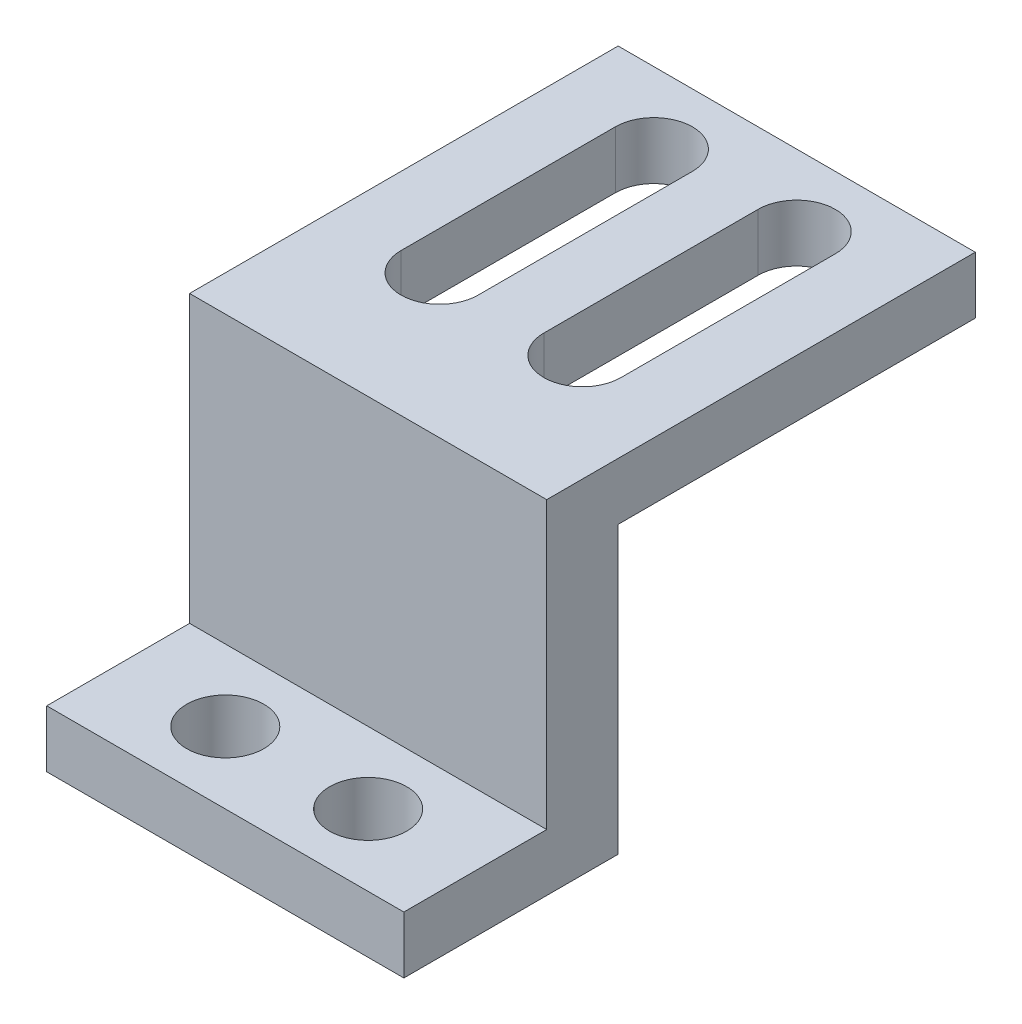
ISO-10303-21;
HEADER;
FILE_DESCRIPTION(('STEP AP214'),'2;1');
FILE_NAME('part.step','',(''),(''),'','','');
FILE_SCHEMA(('AUTOMOTIVE_DESIGN { 1 0 10303 214 1 1 1 1 }'));
ENDSEC;
DATA;
#1=APPLICATION_CONTEXT('core data for automotive mechanical design processes');
#2=APPLICATION_PROTOCOL_DEFINITION('international standard','automotive_design',2000,#1);
#3=PRODUCT_CONTEXT('',#1,'mechanical');
#4=PRODUCT('Part','Part','',(#3));
#5=PRODUCT_RELATED_PRODUCT_CATEGORY('part','',(#4));
#6=PRODUCT_DEFINITION_FORMATION('','',#4);
#7=PRODUCT_DEFINITION_CONTEXT('part definition',#1,'design');
#8=PRODUCT_DEFINITION('design','',#6,#7);
#9=PRODUCT_DEFINITION_SHAPE('','',#8);
#10=(LENGTH_UNIT() NAMED_UNIT(*) SI_UNIT(.MILLI.,.METRE.));
#11=(NAMED_UNIT(*) PLANE_ANGLE_UNIT() SI_UNIT($,.RADIAN.));
#12=(NAMED_UNIT(*) SI_UNIT($,.STERADIAN.) SOLID_ANGLE_UNIT());
#13=UNCERTAINTY_MEASURE_WITH_UNIT(LENGTH_MEASURE(1.E-05),#10,'distance_accuracy_value','');
#14=(GEOMETRIC_REPRESENTATION_CONTEXT(3) GLOBAL_UNCERTAINTY_ASSIGNED_CONTEXT((#13)) GLOBAL_UNIT_ASSIGNED_CONTEXT((#10,
#11,#12)) REPRESENTATION_CONTEXT('',''));
#15=CARTESIAN_POINT('',(0.,0.,0.));
#16=DIRECTION('',(0.,0.,1.));
#17=DIRECTION('',(1.,0.,0.));
#18=AXIS2_PLACEMENT_3D('',#15,#16,#17);
#19=CARTESIAN_POINT('',(15.875,5.08,0.));
#20=DIRECTION('',(0.,0.,-1.));
#21=DIRECTION('',(0.,1.,0.));
#22=AXIS2_PLACEMENT_3D('',#19,#20,#21);
#23=PLANE('',#22);
#24=DIRECTION('',(0.,-1.,0.));
#25=VECTOR('',#24,1.);
#26=CARTESIAN_POINT('',(-15.875,5.08,0.));
#27=LINE('',#26,#25);
#28=CARTESIAN_POINT('',(-15.875,5.08,0.));
#29=VERTEX_POINT('',#28);
#30=CARTESIAN_POINT('',(-15.875,0.,0.));
#31=VERTEX_POINT('',#30);
#32=EDGE_CURVE('E226',#29,#31,#27,.T.);
#33=ORIENTED_EDGE('',*,*,#32,.T.);
#34=DIRECTION('',(-1.,0.,0.));
#35=VECTOR('',#34,1.);
#36=CARTESIAN_POINT('',(15.875,0.,0.));
#37=LINE('',#36,#35);
#38=CARTESIAN_POINT('',(15.875,0.,0.));
#39=VERTEX_POINT('',#38);
#40=EDGE_CURVE('E11',#39,#31,#37,.T.);
#41=ORIENTED_EDGE('',*,*,#40,.F.);
#42=DIRECTION('',(0.,-1.,0.));
#43=VECTOR('',#42,1.);
#44=CARTESIAN_POINT('',(15.875,5.08,0.));
#45=LINE('',#44,#43);
#46=CARTESIAN_POINT('',(15.875,5.08,0.));
#47=VERTEX_POINT('',#46);
#48=EDGE_CURVE('E227',#47,#39,#45,.T.);
#49=ORIENTED_EDGE('',*,*,#48,.F.);
#50=DIRECTION('',(-1.,0.,0.));
#51=VECTOR('',#50,1.);
#52=CARTESIAN_POINT('',(15.875,5.08,0.));
#53=LINE('',#52,#51);
#54=EDGE_CURVE('E245',#47,#29,#53,.T.);
#55=ORIENTED_EDGE('',*,*,#54,.T.);
#56=EDGE_LOOP('',(#33,#41,#49,#55));
#57=FACE_BOUND('',#56,.T.);
#58=ADVANCED_FACE('F35',(#57),#23,.F.);
#59=CARTESIAN_POINT('',(15.875,0.,0.));
#60=DIRECTION('',(0.,1.,0.));
#61=DIRECTION('',(0.,0.,1.));
#62=AXIS2_PLACEMENT_3D('',#59,#60,#61);
#63=PLANE('',#62);
#64=CARTESIAN_POINT('',(6.35,0.,-6.35));
#65=DIRECTION('',(0.,1.,0.));
#66=DIRECTION('',(0.,0.,1.));
#67=AXIS2_PLACEMENT_3D('',#64,#65,#66);
#68=CIRCLE('',#67,3.429);
#69=CARTESIAN_POINT('',(6.35,0.,-2.921));
#70=VERTEX_POINT('',#69);
#71=EDGE_CURVE('E181',#70,#70,#68,.T.);
#72=ORIENTED_EDGE('',*,*,#71,.T.);
#73=EDGE_LOOP('',(#72));
#74=FACE_BOUND('',#73,.T.);
#75=CARTESIAN_POINT('',(-6.35,0.,-6.35));
#76=DIRECTION('',(0.,1.,0.));
#77=DIRECTION('',(0.,0.,1.));
#78=AXIS2_PLACEMENT_3D('',#75,#76,#77);
#79=CIRCLE('',#78,3.429);
#80=CARTESIAN_POINT('',(-6.35,0.,-2.921));
#81=VERTEX_POINT('',#80);
#82=EDGE_CURVE('E184',#81,#81,#79,.T.);
#83=ORIENTED_EDGE('',*,*,#82,.T.);
#84=EDGE_LOOP('',(#83));
#85=FACE_BOUND('',#84,.T.);
#86=DIRECTION('',(0.,0.,-1.));
#87=VECTOR('',#86,1.);
#88=CARTESIAN_POINT('',(-15.875,0.,0.));
#89=LINE('',#88,#87);
#90=CARTESIAN_POINT('',(-15.875,0.,-19.05));
#91=VERTEX_POINT('',#90);
#92=EDGE_CURVE('E248',#31,#91,#89,.T.);
#93=ORIENTED_EDGE('',*,*,#92,.T.);
#94=DIRECTION('',(-1.,0.,0.));
#95=VECTOR('',#94,1.);
#96=CARTESIAN_POINT('',(15.875,0.,-19.05));
#97=LINE('',#96,#95);
#98=CARTESIAN_POINT('',(15.875,0.,-19.05));
#99=VERTEX_POINT('',#98);
#100=EDGE_CURVE('E43',#99,#91,#97,.T.);
#101=ORIENTED_EDGE('',*,*,#100,.F.);
#102=DIRECTION('',(0.,0.,-1.));
#103=VECTOR('',#102,1.);
#104=CARTESIAN_POINT('',(15.875,0.,0.));
#105=LINE('',#104,#103);
#106=EDGE_CURVE('E230',#39,#99,#105,.T.);
#107=ORIENTED_EDGE('',*,*,#106,.F.);
#108=ORIENTED_EDGE('',*,*,#40,.T.);
#109=EDGE_LOOP('',(#93,#101,#107,#108));
#110=FACE_BOUND('',#109,.T.);
#111=ADVANCED_FACE('F308',(#74,#85,#110),#63,.F.);
#112=CARTESIAN_POINT('',(15.875,0.,-19.05));
#113=DIRECTION('',(0.,0.,1.));
#114=DIRECTION('',(1.,0.,0.));
#115=AXIS2_PLACEMENT_3D('',#112,#113,#114);
#116=PLANE('',#115);
#117=DIRECTION('',(0.,1.,0.));
#118=VECTOR('',#117,1.);
#119=CARTESIAN_POINT('',(-15.875,0.,-19.05));
#120=LINE('',#119,#118);
#121=CARTESIAN_POINT('',(-15.875,25.4,-19.05));
#122=VERTEX_POINT('',#121);
#123=EDGE_CURVE('E250',#91,#122,#120,.T.);
#124=ORIENTED_EDGE('',*,*,#123,.T.);
#125=DIRECTION('',(-1.,0.,0.));
#126=VECTOR('',#125,1.);
#127=CARTESIAN_POINT('',(15.875,25.4,-19.05));
#128=LINE('',#127,#126);
#129=CARTESIAN_POINT('',(15.875,25.4,-19.05));
#130=VERTEX_POINT('',#129);
#131=EDGE_CURVE('E277',#130,#122,#128,.T.);
#132=ORIENTED_EDGE('',*,*,#131,.F.);
#133=DIRECTION('',(0.,1.,0.));
#134=VECTOR('',#133,1.);
#135=CARTESIAN_POINT('',(15.875,0.,-19.05));
#136=LINE('',#135,#134);
#137=EDGE_CURVE('E233',#99,#130,#136,.T.);
#138=ORIENTED_EDGE('',*,*,#137,.F.);
#139=ORIENTED_EDGE('',*,*,#100,.T.);
#140=EDGE_LOOP('',(#124,#132,#138,#139));
#141=FACE_BOUND('',#140,.T.);
#142=ADVANCED_FACE('F313',(#141),#116,.F.);
#143=CARTESIAN_POINT('',(15.875,25.4,-50.8));
#144=DIRECTION('',(0.,1.,0.));
#145=DIRECTION('',(0.,0.,1.));
#146=AXIS2_PLACEMENT_3D('',#143,#144,#145);
#147=PLANE('',#146);
#148=DIRECTION('',(0.,0.,-1.));
#149=VECTOR('',#148,1.);
#150=CARTESIAN_POINT('',(-2.92100000000001,25.4,-50.8));
#151=LINE('',#150,#149);
#152=CARTESIAN_POINT('',(-2.921,25.4,-25.4));
#153=VERTEX_POINT('',#152);
#154=CARTESIAN_POINT('',(-2.921,25.4,-44.45));
#155=VERTEX_POINT('',#154);
#156=EDGE_CURVE('E220',#153,#155,#151,.T.);
#157=ORIENTED_EDGE('',*,*,#156,.T.);
#158=CARTESIAN_POINT('',(-6.35,25.4,-44.45));
#159=DIRECTION('',(0.,1.,0.));
#160=DIRECTION('',(0.,0.,1.));
#161=AXIS2_PLACEMENT_3D('',#158,#159,#160);
#162=CIRCLE('',#161,3.429);
#163=CARTESIAN_POINT('',(-9.779,25.4,-44.45));
#164=VERTEX_POINT('',#163);
#165=EDGE_CURVE('E223',#155,#164,#162,.T.);
#166=ORIENTED_EDGE('',*,*,#165,.T.);
#167=DIRECTION('',(0.,0.,1.));
#168=VECTOR('',#167,1.);
#169=CARTESIAN_POINT('',(-9.779,25.4,-50.8));
#170=LINE('',#169,#168);
#171=CARTESIAN_POINT('',(-9.779,25.4,-25.4));
#172=VERTEX_POINT('',#171);
#173=EDGE_CURVE('E214',#164,#172,#170,.T.);
#174=ORIENTED_EDGE('',*,*,#173,.T.);
#175=CARTESIAN_POINT('',(-6.35,25.4,-25.4));
#176=DIRECTION('',(0.,1.,0.));
#177=DIRECTION('',(0.,0.,1.));
#178=AXIS2_PLACEMENT_3D('',#175,#176,#177);
#179=CIRCLE('',#178,3.429);
#180=EDGE_CURVE('E217',#172,#153,#179,.T.);
#181=ORIENTED_EDGE('',*,*,#180,.T.);
#182=EDGE_LOOP('',(#157,#166,#174,#181));
#183=FACE_BOUND('',#182,.T.);
#184=DIRECTION('',(0.,0.,-1.));
#185=VECTOR('',#184,1.);
#186=CARTESIAN_POINT('',(9.77900000000001,25.4,-50.8));
#187=LINE('',#186,#185);
#188=CARTESIAN_POINT('',(9.77900000000001,25.4,-25.4));
#189=VERTEX_POINT('',#188);
#190=CARTESIAN_POINT('',(9.77900000000001,25.4,-44.45));
#191=VERTEX_POINT('',#190);
#192=EDGE_CURVE('E208',#189,#191,#187,.T.);
#193=ORIENTED_EDGE('',*,*,#192,.T.);
#194=CARTESIAN_POINT('',(6.35,25.4,-44.45));
#195=DIRECTION('',(0.,1.,0.));
#196=DIRECTION('',(0.,0.,1.));
#197=AXIS2_PLACEMENT_3D('',#194,#195,#196);
#198=CIRCLE('',#197,3.42900000000001);
#199=CARTESIAN_POINT('',(2.92099999999999,25.4,-44.45));
#200=VERTEX_POINT('',#199);
#201=EDGE_CURVE('E211',#191,#200,#198,.T.);
#202=ORIENTED_EDGE('',*,*,#201,.T.);
#203=DIRECTION('',(0.,0.,1.));
#204=VECTOR('',#203,1.);
#205=CARTESIAN_POINT('',(2.92099999999999,25.4,-50.8));
#206=LINE('',#205,#204);
#207=CARTESIAN_POINT('',(2.921,25.4,-25.4));
#208=VERTEX_POINT('',#207);
#209=EDGE_CURVE('E205',#200,#208,#206,.T.);
#210=ORIENTED_EDGE('',*,*,#209,.T.);
#211=CARTESIAN_POINT('',(6.35,25.4,-25.4));
#212=DIRECTION('',(0.,1.,0.));
#213=DIRECTION('',(0.,0.,1.));
#214=AXIS2_PLACEMENT_3D('',#211,#212,#213);
#215=CIRCLE('',#214,3.429);
#216=EDGE_CURVE('E154',#208,#189,#215,.T.);
#217=ORIENTED_EDGE('',*,*,#216,.T.);
#218=EDGE_LOOP('',(#193,#202,#210,#217));
#219=FACE_BOUND('',#218,.T.);
#220=DIRECTION('',(0.,0.,-1.));
#221=VECTOR('',#220,1.);
#222=CARTESIAN_POINT('',(-15.875,25.4,-50.8));
#223=LINE('',#222,#221);
#224=CARTESIAN_POINT('',(-15.875,25.4,-50.8));
#225=VERTEX_POINT('',#224);
#226=EDGE_CURVE('E253',#122,#225,#223,.T.);
#227=ORIENTED_EDGE('',*,*,#226,.T.);
#228=DIRECTION('',(-1.,0.,0.));
#229=VECTOR('',#228,1.);
#230=CARTESIAN_POINT('',(15.875,25.4,-50.8));
#231=LINE('',#230,#229);
#232=CARTESIAN_POINT('',(15.875,25.4,-50.8));
#233=VERTEX_POINT('',#232);
#234=EDGE_CURVE('E274',#233,#225,#231,.T.);
#235=ORIENTED_EDGE('',*,*,#234,.F.);
#236=DIRECTION('',(0.,0.,-1.));
#237=VECTOR('',#236,1.);
#238=CARTESIAN_POINT('',(15.875,25.4,-19.05));
#239=LINE('',#238,#237);
#240=EDGE_CURVE('E235',#130,#233,#239,.T.);
#241=ORIENTED_EDGE('',*,*,#240,.F.);
#242=ORIENTED_EDGE('',*,*,#131,.T.);
#243=EDGE_LOOP('',(#227,#235,#241,#242));
#244=FACE_BOUND('',#243,.T.);
#245=ADVANCED_FACE('F345',(#183,#219,#244),#147,.F.);
#246=CARTESIAN_POINT('',(15.875,30.48,-50.8));
#247=DIRECTION('',(0.,0.,1.));
#248=DIRECTION('',(1.,0.,0.));
#249=AXIS2_PLACEMENT_3D('',#246,#247,#248);
#250=PLANE('',#249);
#251=DIRECTION('',(0.,1.,0.));
#252=VECTOR('',#251,1.);
#253=CARTESIAN_POINT('',(-15.875,30.48,-50.8));
#254=LINE('',#253,#252);
#255=CARTESIAN_POINT('',(-15.875,30.48,-50.8));
#256=VERTEX_POINT('',#255);
#257=EDGE_CURVE('E255',#225,#256,#254,.T.);
#258=ORIENTED_EDGE('',*,*,#257,.T.);
#259=DIRECTION('',(-1.,0.,0.));
#260=VECTOR('',#259,1.);
#261=CARTESIAN_POINT('',(15.875,30.48,-50.8));
#262=LINE('',#261,#260);
#263=CARTESIAN_POINT('',(15.875,30.48,-50.8));
#264=VERTEX_POINT('',#263);
#265=EDGE_CURVE('E271',#264,#256,#262,.T.);
#266=ORIENTED_EDGE('',*,*,#265,.F.);
#267=DIRECTION('',(0.,1.,0.));
#268=VECTOR('',#267,1.);
#269=CARTESIAN_POINT('',(15.875,30.48,-50.8));
#270=LINE('',#269,#268);
#271=EDGE_CURVE('E237',#233,#264,#270,.T.);
#272=ORIENTED_EDGE('',*,*,#271,.F.);
#273=ORIENTED_EDGE('',*,*,#234,.T.);
#274=EDGE_LOOP('',(#258,#266,#272,#273));
#275=FACE_BOUND('',#274,.T.);
#276=ADVANCED_FACE('F338',(#275),#250,.F.);
#277=CARTESIAN_POINT('',(15.875,30.48,-31.75));
#278=DIRECTION('',(0.,-1.,0.));
#279=DIRECTION('',(0.,0.,-1.));
#280=AXIS2_PLACEMENT_3D('',#277,#278,#279);
#281=PLANE('',#280);
#282=DIRECTION('',(0.,0.,1.));
#283=VECTOR('',#282,1.);
#284=CARTESIAN_POINT('',(-9.779,30.48,-44.45));
#285=LINE('',#284,#283);
#286=CARTESIAN_POINT('',(-9.77899999999999,30.48,-44.45));
#287=VERTEX_POINT('',#286);
#288=CARTESIAN_POINT('',(-9.779,30.48,-25.4));
#289=VERTEX_POINT('',#288);
#290=EDGE_CURVE('E187',#287,#289,#285,.T.);
#291=ORIENTED_EDGE('',*,*,#290,.F.);
#292=CARTESIAN_POINT('',(-6.35,30.48,-44.45));
#293=DIRECTION('',(0.,1.,0.));
#294=DIRECTION('',(0.,0.,1.));
#295=AXIS2_PLACEMENT_3D('',#292,#293,#294);
#296=CIRCLE('',#295,3.429);
#297=CARTESIAN_POINT('',(-2.921,30.48,-44.45));
#298=VERTEX_POINT('',#297);
#299=EDGE_CURVE('E178',#298,#287,#296,.T.);
#300=ORIENTED_EDGE('',*,*,#299,.F.);
#301=DIRECTION('',(0.,0.,-1.));
#302=VECTOR('',#301,1.);
#303=CARTESIAN_POINT('',(-2.921,30.48,-44.45));
#304=LINE('',#303,#302);
#305=CARTESIAN_POINT('',(-2.921,30.48,-25.4));
#306=VERTEX_POINT('',#305);
#307=EDGE_CURVE('E192',#306,#298,#304,.T.);
#308=ORIENTED_EDGE('',*,*,#307,.F.);
#309=CARTESIAN_POINT('',(-6.35,30.48,-25.4));
#310=DIRECTION('',(0.,1.,0.));
#311=DIRECTION('',(0.,0.,1.));
#312=AXIS2_PLACEMENT_3D('',#309,#310,#311);
#313=CIRCLE('',#312,3.429);
#314=EDGE_CURVE('E189',#289,#306,#313,.T.);
#315=ORIENTED_EDGE('',*,*,#314,.F.);
#316=EDGE_LOOP('',(#291,#300,#308,#315));
#317=FACE_BOUND('',#316,.T.);
#318=DIRECTION('',(0.,0.,1.));
#319=VECTOR('',#318,1.);
#320=CARTESIAN_POINT('',(2.92099999999999,30.48,-44.45));
#321=LINE('',#320,#319);
#322=CARTESIAN_POINT('',(2.92099999999999,30.48,-44.45));
#323=VERTEX_POINT('',#322);
#324=CARTESIAN_POINT('',(2.921,30.48,-25.4));
#325=VERTEX_POINT('',#324);
#326=EDGE_CURVE('E161',#323,#325,#321,.T.);
#327=ORIENTED_EDGE('',*,*,#326,.F.);
#328=CARTESIAN_POINT('',(6.35,30.48,-44.45));
#329=DIRECTION('',(0.,1.,0.));
#330=DIRECTION('',(0.,0.,1.));
#331=AXIS2_PLACEMENT_3D('',#328,#329,#330);
#332=CIRCLE('',#331,3.42900000000001);
#333=CARTESIAN_POINT('',(9.77900000000001,30.48,-44.45));
#334=VERTEX_POINT('',#333);
#335=EDGE_CURVE('E166',#334,#323,#332,.T.);
#336=ORIENTED_EDGE('',*,*,#335,.F.);
#337=DIRECTION('',(0.,0.,-1.));
#338=VECTOR('',#337,1.);
#339=CARTESIAN_POINT('',(9.77900000000001,30.48,-44.45));
#340=LINE('',#339,#338);
#341=CARTESIAN_POINT('',(9.77900000000001,30.48,-25.4));
#342=VERTEX_POINT('',#341);
#343=EDGE_CURVE('E171',#342,#334,#340,.T.);
#344=ORIENTED_EDGE('',*,*,#343,.F.);
#345=CARTESIAN_POINT('',(6.35,30.48,-25.4));
#346=DIRECTION('',(0.,1.,0.));
#347=DIRECTION('',(0.,0.,1.));
#348=AXIS2_PLACEMENT_3D('',#345,#346,#347);
#349=CIRCLE('',#348,3.429);
#350=EDGE_CURVE('E151',#325,#342,#349,.T.);
#351=ORIENTED_EDGE('',*,*,#350,.F.);
#352=EDGE_LOOP('',(#327,#336,#344,#351));
#353=FACE_BOUND('',#352,.T.);
#354=DIRECTION('',(0.,0.,1.));
#355=VECTOR('',#354,1.);
#356=CARTESIAN_POINT('',(-15.875,30.48,-31.75));
#357=LINE('',#356,#355);
#358=CARTESIAN_POINT('',(-15.875,30.48,-12.7));
#359=VERTEX_POINT('',#358);
#360=EDGE_CURVE('E258',#256,#359,#357,.T.);
#361=ORIENTED_EDGE('',*,*,#360,.T.);
#362=DIRECTION('',(-1.,0.,0.));
#363=VECTOR('',#362,1.);
#364=CARTESIAN_POINT('',(15.875,30.48,-12.7));
#365=LINE('',#364,#363);
#366=CARTESIAN_POINT('',(15.875,30.48,-12.7));
#367=VERTEX_POINT('',#366);
#368=EDGE_CURVE('E268',#367,#359,#365,.T.);
#369=ORIENTED_EDGE('',*,*,#368,.F.);
#370=DIRECTION('',(0.,0.,1.));
#371=VECTOR('',#370,1.);
#372=CARTESIAN_POINT('',(15.875,30.48,-31.75));
#373=LINE('',#372,#371);
#374=EDGE_CURVE('E239',#264,#367,#373,.T.);
#375=ORIENTED_EDGE('',*,*,#374,.F.);
#376=ORIENTED_EDGE('',*,*,#265,.T.);
#377=EDGE_LOOP('',(#361,#369,#375,#376));
#378=FACE_BOUND('',#377,.T.);
#379=ADVANCED_FACE('F168',(#317,#353,#378),#281,.F.);
#380=CARTESIAN_POINT('',(15.875,30.48,-12.7));
#381=DIRECTION('',(0.,0.,-1.));
#382=DIRECTION('',(0.,1.,0.));
#383=AXIS2_PLACEMENT_3D('',#380,#381,#382);
#384=PLANE('',#383);
#385=DIRECTION('',(0.,-1.,0.));
#386=VECTOR('',#385,1.);
#387=CARTESIAN_POINT('',(-15.875,30.48,-12.7));
#388=LINE('',#387,#386);
#389=CARTESIAN_POINT('',(-15.875,5.08,-12.7));
#390=VERTEX_POINT('',#389);
#391=EDGE_CURVE('E260',#359,#390,#388,.T.);
#392=ORIENTED_EDGE('',*,*,#391,.T.);
#393=DIRECTION('',(-1.,0.,0.));
#394=VECTOR('',#393,1.);
#395=CARTESIAN_POINT('',(15.875,5.08,-12.7));
#396=LINE('',#395,#394);
#397=CARTESIAN_POINT('',(15.875,5.08,-12.7));
#398=VERTEX_POINT('',#397);
#399=EDGE_CURVE('E265',#398,#390,#396,.T.);
#400=ORIENTED_EDGE('',*,*,#399,.F.);
#401=DIRECTION('',(0.,-1.,0.));
#402=VECTOR('',#401,1.);
#403=CARTESIAN_POINT('',(15.875,30.48,-12.7));
#404=LINE('',#403,#402);
#405=EDGE_CURVE('E241',#367,#398,#404,.T.);
#406=ORIENTED_EDGE('',*,*,#405,.F.);
#407=ORIENTED_EDGE('',*,*,#368,.T.);
#408=EDGE_LOOP('',(#392,#400,#406,#407));
#409=FACE_BOUND('',#408,.T.);
#410=ADVANCED_FACE('F333',(#409),#384,.F.);
#411=CARTESIAN_POINT('',(15.875,5.08,-12.7));
#412=DIRECTION('',(0.,-1.,0.));
#413=DIRECTION('',(0.,0.,-1.));
#414=AXIS2_PLACEMENT_3D('',#411,#412,#413);
#415=PLANE('',#414);
#416=CARTESIAN_POINT('',(6.35,5.08,-6.35));
#417=DIRECTION('',(0.,-1.,0.));
#418=DIRECTION('',(0.,0.,-1.));
#419=AXIS2_PLACEMENT_3D('',#416,#417,#418);
#420=CIRCLE('',#419,3.429);
#421=CARTESIAN_POINT('',(6.35,5.08,-2.921));
#422=VERTEX_POINT('',#421);
#423=EDGE_CURVE('E38',#422,#422,#420,.T.);
#424=ORIENTED_EDGE('',*,*,#423,.T.);
#425=EDGE_LOOP('',(#424));
#426=FACE_BOUND('',#425,.T.);
#427=CARTESIAN_POINT('',(-6.35,5.08,-6.35));
#428=DIRECTION('',(0.,-1.,0.));
#429=DIRECTION('',(0.,0.,-1.));
#430=AXIS2_PLACEMENT_3D('',#427,#428,#429);
#431=CIRCLE('',#430,3.429);
#432=CARTESIAN_POINT('',(-6.35,5.08,-2.921));
#433=VERTEX_POINT('',#432);
#434=EDGE_CURVE('E204',#433,#433,#431,.T.);
#435=ORIENTED_EDGE('',*,*,#434,.T.);
#436=EDGE_LOOP('',(#435));
#437=FACE_BOUND('',#436,.T.);
#438=DIRECTION('',(0.,0.,1.));
#439=VECTOR('',#438,1.);
#440=CARTESIAN_POINT('',(-15.875,5.08,-12.7));
#441=LINE('',#440,#439);
#442=EDGE_CURVE('E231',#390,#29,#441,.T.);
#443=ORIENTED_EDGE('',*,*,#442,.T.);
#444=ORIENTED_EDGE('',*,*,#54,.F.);
#445=DIRECTION('',(0.,0.,1.));
#446=VECTOR('',#445,1.);
#447=CARTESIAN_POINT('',(15.875,5.08,-12.7));
#448=LINE('',#447,#446);
#449=EDGE_CURVE('E243',#398,#47,#448,.T.);
#450=ORIENTED_EDGE('',*,*,#449,.F.);
#451=ORIENTED_EDGE('',*,*,#399,.T.);
#452=EDGE_LOOP('',(#443,#444,#450,#451));
#453=FACE_BOUND('',#452,.T.);
#454=ADVANCED_FACE('F287',(#426,#437,#453),#415,.F.);
#455=CARTESIAN_POINT('',(15.875,0.,0.));
#456=DIRECTION('',(1.,0.,0.));
#457=DIRECTION('',(0.,0.,-1.));
#458=AXIS2_PLACEMENT_3D('',#455,#456,#457);
#459=PLANE('',#458);
#460=ORIENTED_EDGE('',*,*,#48,.T.);
#461=ORIENTED_EDGE('',*,*,#106,.T.);
#462=ORIENTED_EDGE('',*,*,#137,.T.);
#463=ORIENTED_EDGE('',*,*,#240,.T.);
#464=ORIENTED_EDGE('',*,*,#271,.T.);
#465=ORIENTED_EDGE('',*,*,#374,.T.);
#466=ORIENTED_EDGE('',*,*,#405,.T.);
#467=ORIENTED_EDGE('',*,*,#449,.T.);
#468=EDGE_LOOP('',(#460,#461,#462,#463,#464,#465,#466,#467));
#469=FACE_BOUND('',#468,.T.);
#470=ADVANCED_FACE('F327',(#469),#459,.T.);
#471=CARTESIAN_POINT('',(-15.875,0.,0.));
#472=DIRECTION('',(1.,0.,0.));
#473=DIRECTION('',(0.,0.,-1.));
#474=AXIS2_PLACEMENT_3D('',#471,#472,#473);
#475=PLANE('',#474);
#476=ORIENTED_EDGE('',*,*,#32,.F.);
#477=ORIENTED_EDGE('',*,*,#442,.F.);
#478=ORIENTED_EDGE('',*,*,#391,.F.);
#479=ORIENTED_EDGE('',*,*,#360,.F.);
#480=ORIENTED_EDGE('',*,*,#257,.F.);
#481=ORIENTED_EDGE('',*,*,#226,.F.);
#482=ORIENTED_EDGE('',*,*,#123,.F.);
#483=ORIENTED_EDGE('',*,*,#92,.F.);
#484=EDGE_LOOP('',(#476,#477,#478,#479,#480,#481,#482,#483));
#485=FACE_BOUND('',#484,.T.);
#486=ADVANCED_FACE('F302',(#485),#475,.F.);
#487=CARTESIAN_POINT('',(-6.35,0.,-6.35));
#488=DIRECTION('',(0.,1.,0.));
#489=DIRECTION('',(0.,0.,1.));
#490=AXIS2_PLACEMENT_3D('',#487,#488,#489);
#491=CYLINDRICAL_SURFACE('',#490,3.429);
#492=CARTESIAN_POINT('',(-6.35,0.,-2.921));
#493=CARTESIAN_POINT('',(-6.35,0.0529166666666611,-2.921));
#494=CARTESIAN_POINT('',(-6.35,0.105833333333328,-2.921));
#495=CARTESIAN_POINT('',(-6.35,0.211666666666661,-2.921));
#496=CARTESIAN_POINT('',(-6.35,0.264583333333328,-2.921));
#497=CARTESIAN_POINT('',(-6.35,0.370416666666661,-2.921));
#498=CARTESIAN_POINT('',(-6.35,0.423333333333328,-2.921));
#499=CARTESIAN_POINT('',(-6.35,0.529166666666662,-2.921));
#500=CARTESIAN_POINT('',(-6.35,0.582083333333328,-2.921));
#501=CARTESIAN_POINT('',(-6.35,0.687916666666662,-2.921));
#502=CARTESIAN_POINT('',(-6.35,0.740833333333329,-2.921));
#503=CARTESIAN_POINT('',(-6.35,0.846666666666662,-2.921));
#504=CARTESIAN_POINT('',(-6.35,0.899583333333329,-2.921));
#505=CARTESIAN_POINT('',(-6.35,1.00541666666666,-2.921));
#506=CARTESIAN_POINT('',(-6.35,1.05833333333333,-2.921));
#507=CARTESIAN_POINT('',(-6.35,1.16416666666666,-2.921));
#508=CARTESIAN_POINT('',(-6.35,1.21708333333333,-2.921));
#509=CARTESIAN_POINT('',(-6.35,1.32291666666666,-2.921));
#510=CARTESIAN_POINT('',(-6.35,1.37583333333333,-2.921));
#511=CARTESIAN_POINT('',(-6.35,1.48166666666666,-2.921));
#512=CARTESIAN_POINT('',(-6.35,1.53458333333333,-2.921));
#513=CARTESIAN_POINT('',(-6.35,1.64041666666666,-2.921));
#514=CARTESIAN_POINT('',(-6.35,1.69333333333333,-2.921));
#515=CARTESIAN_POINT('',(-6.35,1.79916666666666,-2.921));
#516=CARTESIAN_POINT('',(-6.35,1.85208333333333,-2.921));
#517=CARTESIAN_POINT('',(-6.35,1.95791666666666,-2.921));
#518=CARTESIAN_POINT('',(-6.35,2.01083333333333,-2.921));
#519=CARTESIAN_POINT('',(-6.35,2.11666666666666,-2.921));
#520=CARTESIAN_POINT('',(-6.35,2.16958333333333,-2.921));
#521=CARTESIAN_POINT('',(-6.35,2.27541666666666,-2.921));
#522=CARTESIAN_POINT('',(-6.35,2.32833333333333,-2.921));
#523=CARTESIAN_POINT('',(-6.35,2.43416666666666,-2.921));
#524=CARTESIAN_POINT('',(-6.35,2.48708333333333,-2.921));
#525=CARTESIAN_POINT('',(-6.35,2.59291666666666,-2.921));
#526=CARTESIAN_POINT('',(-6.35,2.64583333333333,-2.921));
#527=CARTESIAN_POINT('',(-6.35,2.75166666666666,-2.921));
#528=CARTESIAN_POINT('',(-6.35,2.80458333333333,-2.921));
#529=CARTESIAN_POINT('',(-6.35,2.91041666666666,-2.921));
#530=CARTESIAN_POINT('',(-6.35,2.96333333333333,-2.921));
#531=CARTESIAN_POINT('',(-6.35,3.06916666666666,-2.921));
#532=CARTESIAN_POINT('',(-6.35,3.12208333333333,-2.921));
#533=CARTESIAN_POINT('',(-6.35,3.22791666666666,-2.921));
#534=CARTESIAN_POINT('',(-6.35,3.28083333333333,-2.921));
#535=CARTESIAN_POINT('',(-6.35,3.38666666666666,-2.921));
#536=CARTESIAN_POINT('',(-6.35,3.43958333333333,-2.921));
#537=CARTESIAN_POINT('',(-6.35,3.54541666666666,-2.921));
#538=CARTESIAN_POINT('',(-6.35,3.59833333333333,-2.921));
#539=CARTESIAN_POINT('',(-6.35,3.70416666666667,-2.921));
#540=CARTESIAN_POINT('',(-6.35,3.75708333333333,-2.921));
#541=CARTESIAN_POINT('',(-6.35,3.86291666666667,-2.921));
#542=CARTESIAN_POINT('',(-6.35,3.91583333333333,-2.921));
#543=CARTESIAN_POINT('',(-6.35,4.02166666666667,-2.921));
#544=CARTESIAN_POINT('',(-6.35,4.07458333333333,-2.921));
#545=CARTESIAN_POINT('',(-6.35,4.18041666666667,-2.921));
#546=CARTESIAN_POINT('',(-6.35,4.23333333333333,-2.921));
#547=CARTESIAN_POINT('',(-6.35,4.33916666666667,-2.921));
#548=CARTESIAN_POINT('',(-6.35,4.39208333333333,-2.921));
#549=CARTESIAN_POINT('',(-6.35,4.49791666666667,-2.921));
#550=CARTESIAN_POINT('',(-6.35,4.55083333333333,-2.921));
#551=CARTESIAN_POINT('',(-6.35,4.65666666666667,-2.921));
#552=CARTESIAN_POINT('',(-6.35,4.70958333333333,-2.921));
#553=CARTESIAN_POINT('',(-6.35,4.81541666666667,-2.921));
#554=CARTESIAN_POINT('',(-6.35,4.86833333333333,-2.921));
#555=CARTESIAN_POINT('',(-6.35,4.97416666666667,-2.921));
#556=CARTESIAN_POINT('',(-6.35,5.02708333333333,-2.921));
#557=CARTESIAN_POINT('',(-6.35,5.08,-2.921));
#558=B_SPLINE_CURVE_WITH_KNOTS('',3,(#492,#493,#494,#495,#496,#497,#498,#499,#500,#501,#502,
#503,#504,#505,#506,#507,#508,#509,#510,#511,#512,#513,#514,#515,#516,#517,#518,#519,#520,#521,
#522,#523,#524,#525,#526,#527,#528,#529,#530,#531,#532,#533,#534,#535,#536,#537,#538,#539,#540,
#541,#542,#543,#544,#545,#546,#547,#548,#549,#550,#551,#552,#553,#554,#555,#556,#557),
.UNSPECIFIED.,.F.,.F.,(4,2,2,2,2,2,2,2,2,2,2,2,2,2,2,2,2,2,2,2,2,2,2,2,2,2,2,2,2,2,2,2,4),(0.,
0.15875,0.3175,0.476250000000001,0.635000000000001,0.793750000000001,0.952500000000001,1.11125,
1.27,1.42875,1.5875,1.74625,1.905,2.06375,2.2225,2.38125,2.54,2.69875,2.8575,3.01625,3.175,
3.33375,3.4925,3.65125,3.81,3.96875000000001,4.12750000000001,4.28625000000001,4.44500000000001,
4.60375000000001,4.76250000000001,4.92125000000001,5.08000000000001),.UNSPECIFIED.);
#559=EDGE_CURVE('BSEAM292',#81,#433,#558,.T.);
#560=ORIENTED_EDGE('',*,*,#82,.F.);
#561=ORIENTED_EDGE('',*,*,#434,.F.);
#562=ORIENTED_EDGE('',*,*,#559,.T.);
#563=ORIENTED_EDGE('',*,*,#559,.F.);
#564=EDGE_LOOP('',(#560,#562,#561,#563));
#565=FACE_BOUND('',#564,.T.);
#566=ADVANCED_FACE('F292',(#565),#491,.F.);
#567=CARTESIAN_POINT('',(6.35,0.,-6.35));
#568=DIRECTION('',(0.,1.,0.));
#569=DIRECTION('',(0.,0.,1.));
#570=AXIS2_PLACEMENT_3D('',#567,#568,#569);
#571=CYLINDRICAL_SURFACE('',#570,3.429);
#572=CARTESIAN_POINT('',(6.35,0.,-2.921));
#573=CARTESIAN_POINT('',(6.35,0.0529166666666611,-2.921));
#574=CARTESIAN_POINT('',(6.35,0.105833333333328,-2.921));
#575=CARTESIAN_POINT('',(6.35,0.211666666666661,-2.921));
#576=CARTESIAN_POINT('',(6.35,0.264583333333328,-2.921));
#577=CARTESIAN_POINT('',(6.35,0.370416666666661,-2.921));
#578=CARTESIAN_POINT('',(6.35,0.423333333333328,-2.921));
#579=CARTESIAN_POINT('',(6.35,0.529166666666662,-2.921));
#580=CARTESIAN_POINT('',(6.35,0.582083333333328,-2.921));
#581=CARTESIAN_POINT('',(6.35,0.687916666666662,-2.921));
#582=CARTESIAN_POINT('',(6.35,0.740833333333329,-2.921));
#583=CARTESIAN_POINT('',(6.35,0.846666666666662,-2.921));
#584=CARTESIAN_POINT('',(6.35,0.899583333333329,-2.921));
#585=CARTESIAN_POINT('',(6.35,1.00541666666666,-2.921));
#586=CARTESIAN_POINT('',(6.35,1.05833333333333,-2.921));
#587=CARTESIAN_POINT('',(6.35,1.16416666666666,-2.921));
#588=CARTESIAN_POINT('',(6.35,1.21708333333333,-2.921));
#589=CARTESIAN_POINT('',(6.35,1.32291666666666,-2.921));
#590=CARTESIAN_POINT('',(6.35,1.37583333333333,-2.921));
#591=CARTESIAN_POINT('',(6.35,1.48166666666666,-2.921));
#592=CARTESIAN_POINT('',(6.35,1.53458333333333,-2.921));
#593=CARTESIAN_POINT('',(6.35,1.64041666666666,-2.921));
#594=CARTESIAN_POINT('',(6.35,1.69333333333333,-2.921));
#595=CARTESIAN_POINT('',(6.35,1.79916666666666,-2.921));
#596=CARTESIAN_POINT('',(6.35,1.85208333333333,-2.921));
#597=CARTESIAN_POINT('',(6.35,1.95791666666666,-2.921));
#598=CARTESIAN_POINT('',(6.35,2.01083333333333,-2.921));
#599=CARTESIAN_POINT('',(6.35,2.11666666666666,-2.921));
#600=CARTESIAN_POINT('',(6.35,2.16958333333333,-2.921));
#601=CARTESIAN_POINT('',(6.35,2.27541666666666,-2.921));
#602=CARTESIAN_POINT('',(6.35,2.32833333333333,-2.921));
#603=CARTESIAN_POINT('',(6.35,2.43416666666666,-2.921));
#604=CARTESIAN_POINT('',(6.35,2.48708333333333,-2.921));
#605=CARTESIAN_POINT('',(6.35,2.59291666666666,-2.921));
#606=CARTESIAN_POINT('',(6.35,2.64583333333333,-2.921));
#607=CARTESIAN_POINT('',(6.35,2.75166666666666,-2.921));
#608=CARTESIAN_POINT('',(6.35,2.80458333333333,-2.921));
#609=CARTESIAN_POINT('',(6.35,2.91041666666666,-2.921));
#610=CARTESIAN_POINT('',(6.35,2.96333333333333,-2.921));
#611=CARTESIAN_POINT('',(6.35,3.06916666666666,-2.921));
#612=CARTESIAN_POINT('',(6.35,3.12208333333333,-2.921));
#613=CARTESIAN_POINT('',(6.35,3.22791666666666,-2.921));
#614=CARTESIAN_POINT('',(6.35,3.28083333333333,-2.921));
#615=CARTESIAN_POINT('',(6.35,3.38666666666666,-2.921));
#616=CARTESIAN_POINT('',(6.35,3.43958333333333,-2.921));
#617=CARTESIAN_POINT('',(6.35,3.54541666666666,-2.921));
#618=CARTESIAN_POINT('',(6.35,3.59833333333333,-2.921));
#619=CARTESIAN_POINT('',(6.35,3.70416666666667,-2.921));
#620=CARTESIAN_POINT('',(6.35,3.75708333333333,-2.921));
#621=CARTESIAN_POINT('',(6.35,3.86291666666667,-2.921));
#622=CARTESIAN_POINT('',(6.35,3.91583333333333,-2.921));
#623=CARTESIAN_POINT('',(6.35,4.02166666666667,-2.921));
#624=CARTESIAN_POINT('',(6.35,4.07458333333333,-2.921));
#625=CARTESIAN_POINT('',(6.35,4.18041666666667,-2.921));
#626=CARTESIAN_POINT('',(6.35,4.23333333333333,-2.921));
#627=CARTESIAN_POINT('',(6.35,4.33916666666667,-2.921));
#628=CARTESIAN_POINT('',(6.35,4.39208333333333,-2.921));
#629=CARTESIAN_POINT('',(6.35,4.49791666666667,-2.921));
#630=CARTESIAN_POINT('',(6.35,4.55083333333333,-2.921));
#631=CARTESIAN_POINT('',(6.35,4.65666666666667,-2.921));
#632=CARTESIAN_POINT('',(6.35,4.70958333333333,-2.921));
#633=CARTESIAN_POINT('',(6.35,4.81541666666667,-2.921));
#634=CARTESIAN_POINT('',(6.35,4.86833333333333,-2.921));
#635=CARTESIAN_POINT('',(6.35,4.97416666666667,-2.921));
#636=CARTESIAN_POINT('',(6.35,5.02708333333333,-2.921));
#637=CARTESIAN_POINT('',(6.35,5.08,-2.921));
#638=B_SPLINE_CURVE_WITH_KNOTS('',3,(#572,#573,#574,#575,#576,#577,#578,#579,#580,#581,#582,
#583,#584,#585,#586,#587,#588,#589,#590,#591,#592,#593,#594,#595,#596,#597,#598,#599,#600,#601,
#602,#603,#604,#605,#606,#607,#608,#609,#610,#611,#612,#613,#614,#615,#616,#617,#618,#619,#620,
#621,#622,#623,#624,#625,#626,#627,#628,#629,#630,#631,#632,#633,#634,#635,#636,#637),
.UNSPECIFIED.,.F.,.F.,(4,2,2,2,2,2,2,2,2,2,2,2,2,2,2,2,2,2,2,2,2,2,2,2,2,2,2,2,2,2,2,2,4),(0.,
0.15875,0.3175,0.476250000000001,0.635000000000001,0.793750000000001,0.952500000000001,1.11125,
1.27,1.42875,1.5875,1.74625,1.905,2.06375,2.2225,2.38125,2.54,2.69875,2.8575,3.01625,3.175,
3.33375,3.4925,3.65125,3.81,3.96875000000001,4.12750000000001,4.28625000000001,4.44500000000001,
4.60375000000001,4.76250000000001,4.92125000000001,5.08000000000001),.UNSPECIFIED.);
#639=EDGE_CURVE('BSEAM289',#70,#422,#638,.T.);
#640=ORIENTED_EDGE('',*,*,#71,.F.);
#641=ORIENTED_EDGE('',*,*,#423,.F.);
#642=ORIENTED_EDGE('',*,*,#639,.T.);
#643=ORIENTED_EDGE('',*,*,#639,.F.);
#644=EDGE_LOOP('',(#640,#642,#641,#643));
#645=FACE_BOUND('',#644,.T.);
#646=ADVANCED_FACE('F289',(#645),#571,.F.);
#647=CARTESIAN_POINT('',(6.35,0.,-44.45));
#648=DIRECTION('',(0.,1.,0.));
#649=DIRECTION('',(0.,0.,1.));
#650=AXIS2_PLACEMENT_3D('',#647,#648,#649);
#651=CYLINDRICAL_SURFACE('',#650,3.42900000000001);
#652=DIRECTION('',(0.,1.,0.));
#653=VECTOR('',#652,1.);
#654=CARTESIAN_POINT('',(9.77900000000001,0.,-44.45));
#655=LINE('',#654,#653);
#656=EDGE_CURVE('E176',#191,#334,#655,.T.);
#657=ORIENTED_EDGE('',*,*,#656,.T.);
#658=ORIENTED_EDGE('',*,*,#335,.T.);
#659=DIRECTION('',(0.,1.,0.));
#660=VECTOR('',#659,1.);
#661=CARTESIAN_POINT('',(2.92099999999999,0.,-44.45));
#662=LINE('',#661,#660);
#663=EDGE_CURVE('E157',#200,#323,#662,.T.);
#664=ORIENTED_EDGE('',*,*,#663,.F.);
#665=ORIENTED_EDGE('',*,*,#201,.F.);
#666=EDGE_LOOP('',(#657,#658,#664,#665));
#667=FACE_BOUND('',#666,.T.);
#668=ADVANCED_FACE('F291',(#667),#651,.F.);
#669=CARTESIAN_POINT('',(9.77900000000001,0.,-44.45));
#670=DIRECTION('',(1.,0.,0.));
#671=DIRECTION('',(0.,0.,-1.));
#672=AXIS2_PLACEMENT_3D('',#669,#670,#671);
#673=PLANE('',#672);
#674=DIRECTION('',(0.,1.,0.));
#675=VECTOR('',#674,1.);
#676=CARTESIAN_POINT('',(9.77900000000001,0.,-25.4));
#677=LINE('',#676,#675);
#678=EDGE_CURVE('E156',#189,#342,#677,.T.);
#679=ORIENTED_EDGE('',*,*,#678,.T.);
#680=ORIENTED_EDGE('',*,*,#343,.T.);
#681=ORIENTED_EDGE('',*,*,#656,.F.);
#682=ORIENTED_EDGE('',*,*,#192,.F.);
#683=EDGE_LOOP('',(#679,#680,#681,#682));
#684=FACE_BOUND('',#683,.T.);
#685=ADVANCED_FACE('F299',(#684),#673,.F.);
#686=CARTESIAN_POINT('',(6.35,0.,-25.4));
#687=DIRECTION('',(0.,1.,0.));
#688=DIRECTION('',(0.,0.,1.));
#689=AXIS2_PLACEMENT_3D('',#686,#687,#688);
#690=CYLINDRICAL_SURFACE('',#689,3.429);
#691=DIRECTION('',(0.,1.,0.));
#692=VECTOR('',#691,1.);
#693=CARTESIAN_POINT('',(2.921,0.,-25.4));
#694=LINE('',#693,#692);
#695=EDGE_CURVE('E59',#208,#325,#694,.T.);
#696=ORIENTED_EDGE('',*,*,#695,.T.);
#697=ORIENTED_EDGE('',*,*,#350,.T.);
#698=ORIENTED_EDGE('',*,*,#678,.F.);
#699=ORIENTED_EDGE('',*,*,#216,.F.);
#700=EDGE_LOOP('',(#696,#697,#698,#699));
#701=FACE_BOUND('',#700,.T.);
#702=ADVANCED_FACE('F148',(#701),#690,.F.);
#703=CARTESIAN_POINT('',(2.92099999999999,0.,-44.45));
#704=DIRECTION('',(-1.,0.,0.));
#705=DIRECTION('',(0.,0.,1.));
#706=AXIS2_PLACEMENT_3D('',#703,#704,#705);
#707=PLANE('',#706);
#708=ORIENTED_EDGE('',*,*,#663,.T.);
#709=ORIENTED_EDGE('',*,*,#326,.T.);
#710=ORIENTED_EDGE('',*,*,#695,.F.);
#711=ORIENTED_EDGE('',*,*,#209,.F.);
#712=EDGE_LOOP('',(#708,#709,#710,#711));
#713=FACE_BOUND('',#712,.T.);
#714=ADVANCED_FACE('F162',(#713),#707,.F.);
#715=CARTESIAN_POINT('',(-6.35,0.,-44.45));
#716=DIRECTION('',(0.,1.,0.));
#717=DIRECTION('',(0.,0.,1.));
#718=AXIS2_PLACEMENT_3D('',#715,#716,#717);
#719=CYLINDRICAL_SURFACE('',#718,3.429);
#720=DIRECTION('',(0.,1.,0.));
#721=VECTOR('',#720,1.);
#722=CARTESIAN_POINT('',(-2.921,0.,-44.45));
#723=LINE('',#722,#721);
#724=EDGE_CURVE('E185',#155,#298,#723,.T.);
#725=ORIENTED_EDGE('',*,*,#724,.T.);
#726=ORIENTED_EDGE('',*,*,#299,.T.);
#727=DIRECTION('',(0.,1.,0.));
#728=VECTOR('',#727,1.);
#729=CARTESIAN_POINT('',(-9.779,0.,-44.45));
#730=LINE('',#729,#728);
#731=EDGE_CURVE('E195',#164,#287,#730,.T.);
#732=ORIENTED_EDGE('',*,*,#731,.F.);
#733=ORIENTED_EDGE('',*,*,#165,.F.);
#734=EDGE_LOOP('',(#725,#726,#732,#733));
#735=FACE_BOUND('',#734,.T.);
#736=ADVANCED_FACE('F368',(#735),#719,.F.);
#737=CARTESIAN_POINT('',(-2.921,0.,-44.45));
#738=DIRECTION('',(1.,0.,0.));
#739=DIRECTION('',(0.,0.,-1.));
#740=AXIS2_PLACEMENT_3D('',#737,#738,#739);
#741=PLANE('',#740);
#742=DIRECTION('',(0.,1.,0.));
#743=VECTOR('',#742,1.);
#744=CARTESIAN_POINT('',(-2.921,0.,-25.4));
#745=LINE('',#744,#743);
#746=EDGE_CURVE('E197',#153,#306,#745,.T.);
#747=ORIENTED_EDGE('',*,*,#746,.T.);
#748=ORIENTED_EDGE('',*,*,#307,.T.);
#749=ORIENTED_EDGE('',*,*,#724,.F.);
#750=ORIENTED_EDGE('',*,*,#156,.F.);
#751=EDGE_LOOP('',(#747,#748,#749,#750));
#752=FACE_BOUND('',#751,.T.);
#753=ADVANCED_FACE('F371',(#752),#741,.F.);
#754=CARTESIAN_POINT('',(-6.35,0.,-25.4));
#755=DIRECTION('',(0.,1.,0.));
#756=DIRECTION('',(0.,0.,1.));
#757=AXIS2_PLACEMENT_3D('',#754,#755,#756);
#758=CYLINDRICAL_SURFACE('',#757,3.429);
#759=DIRECTION('',(0.,1.,0.));
#760=VECTOR('',#759,1.);
#761=CARTESIAN_POINT('',(-9.779,0.,-25.4));
#762=LINE('',#761,#760);
#763=EDGE_CURVE('E51',#172,#289,#762,.T.);
#764=ORIENTED_EDGE('',*,*,#763,.T.);
#765=ORIENTED_EDGE('',*,*,#314,.T.);
#766=ORIENTED_EDGE('',*,*,#746,.F.);
#767=ORIENTED_EDGE('',*,*,#180,.F.);
#768=EDGE_LOOP('',(#764,#765,#766,#767));
#769=FACE_BOUND('',#768,.T.);
#770=ADVANCED_FACE('F376',(#769),#758,.F.);
#771=CARTESIAN_POINT('',(-9.779,0.,-44.45));
#772=DIRECTION('',(-1.,0.,0.));
#773=DIRECTION('',(0.,0.,1.));
#774=AXIS2_PLACEMENT_3D('',#771,#772,#773);
#775=PLANE('',#774);
#776=ORIENTED_EDGE('',*,*,#731,.T.);
#777=ORIENTED_EDGE('',*,*,#290,.T.);
#778=ORIENTED_EDGE('',*,*,#763,.F.);
#779=ORIENTED_EDGE('',*,*,#173,.F.);
#780=EDGE_LOOP('',(#776,#777,#778,#779));
#781=FACE_BOUND('',#780,.T.);
#782=ADVANCED_FACE('F373',(#781),#775,.F.);
#783=CLOSED_SHELL('',(#58,#111,#142,#245,#276,#379,#410,#454,#470,#486,#566,#646,#668,#685,#702,
#714,#736,#753,#770,#782));
#784=MANIFOLD_SOLID_BREP('B2',#783);
#785=ADVANCED_BREP_SHAPE_REPRESENTATION('',(#18,#784),#14);
#786=SHAPE_DEFINITION_REPRESENTATION(#9,#785);
ENDSEC;
END-ISO-10303-21;
